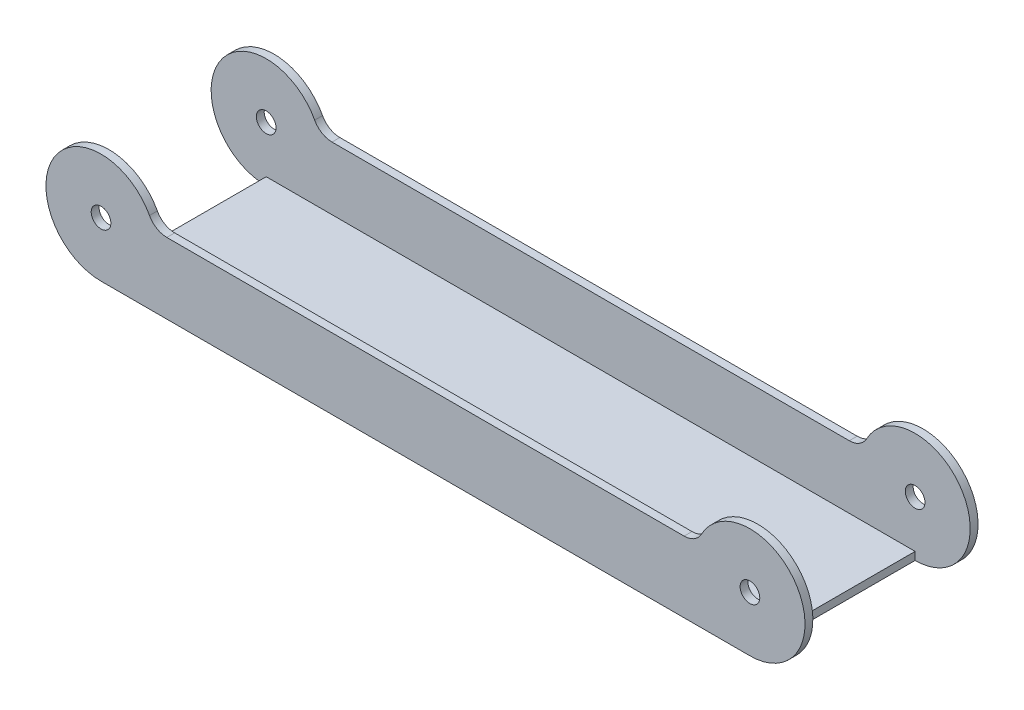
ISO-10303-21;
HEADER;
FILE_DESCRIPTION(('STEP AP214'),'2;1');
FILE_NAME('part.step','',(''),(''),'','','');
FILE_SCHEMA(('AUTOMOTIVE_DESIGN { 1 0 10303 214 1 1 1 1 }'));
ENDSEC;
DATA;
#1=APPLICATION_CONTEXT('core data for automotive mechanical design processes');
#2=APPLICATION_PROTOCOL_DEFINITION('international standard','automotive_design',2000,#1);
#3=PRODUCT_CONTEXT('',#1,'mechanical');
#4=PRODUCT('Part','Part','',(#3));
#5=PRODUCT_RELATED_PRODUCT_CATEGORY('part','',(#4));
#6=PRODUCT_DEFINITION_FORMATION('','',#4);
#7=PRODUCT_DEFINITION_CONTEXT('part definition',#1,'design');
#8=PRODUCT_DEFINITION('design','',#6,#7);
#9=PRODUCT_DEFINITION_SHAPE('','',#8);
#10=(LENGTH_UNIT() NAMED_UNIT(*) SI_UNIT(.MILLI.,.METRE.));
#11=(NAMED_UNIT(*) PLANE_ANGLE_UNIT() SI_UNIT($,.RADIAN.));
#12=(NAMED_UNIT(*) SI_UNIT($,.STERADIAN.) SOLID_ANGLE_UNIT());
#13=UNCERTAINTY_MEASURE_WITH_UNIT(LENGTH_MEASURE(1.E-05),#10,'distance_accuracy_value','');
#14=(GEOMETRIC_REPRESENTATION_CONTEXT(3) GLOBAL_UNCERTAINTY_ASSIGNED_CONTEXT((#13)) GLOBAL_UNIT_ASSIGNED_CONTEXT((#10,
#11,#12)) REPRESENTATION_CONTEXT('',''));
#15=CARTESIAN_POINT('',(0.,0.,0.));
#16=DIRECTION('',(0.,0.,1.));
#17=DIRECTION('',(1.,0.,0.));
#18=AXIS2_PLACEMENT_3D('',#15,#16,#17);
#19=CARTESIAN_POINT('',(82.5,0.,-22.));
#20=DIRECTION('',(0.,0.,1.));
#21=DIRECTION('',(1.,0.,0.));
#22=AXIS2_PLACEMENT_3D('',#19,#20,#21);
#23=CYLINDRICAL_SURFACE('',#22,14.);
#24=CARTESIAN_POINT('',(82.5,0.,-22.));
#25=DIRECTION('',(0.,0.,-1.));
#26=DIRECTION('',(1.,0.,0.));
#27=AXIS2_PLACEMENT_3D('',#24,#25,#26);
#28=CIRCLE('',#27,14.);
#29=CARTESIAN_POINT('',(70.170273293182,6.63157894736842,-22.));
#30=VERTEX_POINT('',#29);
#31=CARTESIAN_POINT('',(82.5,-14.,-22.));
#32=VERTEX_POINT('',#31);
#33=EDGE_CURVE('E276',#30,#32,#28,.T.);
#34=ORIENTED_EDGE('',*,*,#33,.F.);
#35=DIRECTION('',(0.,0.,1.));
#36=VECTOR('',#35,1.);
#37=CARTESIAN_POINT('',(70.170273293182,6.63157894736842,-22.));
#38=LINE('',#37,#36);
#39=CARTESIAN_POINT('',(70.170273293182,6.63157894736842,-20.));
#40=VERTEX_POINT('',#39);
#41=EDGE_CURVE('E139',#30,#40,#38,.T.);
#42=ORIENTED_EDGE('',*,*,#41,.T.);
#43=CARTESIAN_POINT('',(82.5,0.,-20.));
#44=DIRECTION('',(0.,0.,1.));
#45=DIRECTION('',(1.,0.,0.));
#46=AXIS2_PLACEMENT_3D('',#43,#44,#45);
#47=CIRCLE('',#46,14.);
#48=CARTESIAN_POINT('',(82.5,-14.,-20.));
#49=VERTEX_POINT('',#48);
#50=EDGE_CURVE('E132',#40,#49,#47,.F.);
#51=ORIENTED_EDGE('',*,*,#50,.T.);
#52=DIRECTION('',(0.,0.,1.));
#53=VECTOR('',#52,1.);
#54=CARTESIAN_POINT('',(82.5,-14.,-22.));
#55=LINE('',#54,#53);
#56=EDGE_CURVE('E136',#32,#49,#55,.T.);
#57=ORIENTED_EDGE('',*,*,#56,.F.);
#58=EDGE_LOOP('',(#34,#42,#51,#57));
#59=FACE_BOUND('',#58,.T.);
#60=ADVANCED_FACE('F32',(#59),#23,.T.);
#61=CARTESIAN_POINT('',(-82.5,0.,-22.));
#62=DIRECTION('',(0.,0.,1.));
#63=DIRECTION('',(1.,0.,0.));
#64=AXIS2_PLACEMENT_3D('',#61,#62,#63);
#65=CYLINDRICAL_SURFACE('',#64,14.);
#66=CARTESIAN_POINT('',(-82.5,0.,22.));
#67=DIRECTION('',(0.,0.,-1.));
#68=DIRECTION('',(1.,0.,0.));
#69=AXIS2_PLACEMENT_3D('',#66,#67,#68);
#70=CIRCLE('',#69,14.);
#71=CARTESIAN_POINT('',(-82.5,-14.,22.));
#72=VERTEX_POINT('',#71);
#73=CARTESIAN_POINT('',(-70.170273293182,6.63157894736842,22.));
#74=VERTEX_POINT('',#73);
#75=EDGE_CURVE('E269',#72,#74,#70,.T.);
#76=ORIENTED_EDGE('',*,*,#75,.T.);
#77=DIRECTION('',(0.,0.,1.));
#78=VECTOR('',#77,1.);
#79=CARTESIAN_POINT('',(-70.170273293182,6.63157894736842,-22.));
#80=LINE('',#79,#78);
#81=CARTESIAN_POINT('',(-70.170273293182,6.63157894736842,20.));
#82=VERTEX_POINT('',#81);
#83=EDGE_CURVE('E234',#74,#82,#80,.F.);
#84=ORIENTED_EDGE('',*,*,#83,.T.);
#85=CARTESIAN_POINT('',(-82.5,0.,20.));
#86=DIRECTION('',(0.,0.,-1.));
#87=DIRECTION('',(-1.,0.,0.));
#88=AXIS2_PLACEMENT_3D('',#85,#86,#87);
#89=CIRCLE('',#88,14.);
#90=CARTESIAN_POINT('',(-82.5,-14.,20.));
#91=VERTEX_POINT('',#90);
#92=EDGE_CURVE('E177',#82,#91,#89,.F.);
#93=ORIENTED_EDGE('',*,*,#92,.T.);
#94=DIRECTION('',(0.,0.,1.));
#95=VECTOR('',#94,1.);
#96=CARTESIAN_POINT('',(-82.5,-14.,-22.));
#97=LINE('',#96,#95);
#98=EDGE_CURVE('E169',#91,#72,#97,.T.);
#99=ORIENTED_EDGE('',*,*,#98,.T.);
#100=EDGE_LOOP('',(#76,#84,#93,#99));
#101=FACE_BOUND('',#100,.T.);
#102=ADVANCED_FACE('F273',(#101),#65,.T.);
#103=CARTESIAN_POINT('',(0.,-14.,0.));
#104=DIRECTION('',(0.,1.,0.));
#105=DIRECTION('',(0.,0.,1.));
#106=AXIS2_PLACEMENT_3D('',#103,#104,#105);
#107=PLANE('',#106);
#108=ORIENTED_EDGE('',*,*,#56,.T.);
#109=DIRECTION('',(0.,0.,-1.));
#110=VECTOR('',#109,1.);
#111=CARTESIAN_POINT('',(82.5,-14.,20.));
#112=LINE('',#111,#110);
#113=CARTESIAN_POINT('',(82.5,-14.,20.));
#114=VERTEX_POINT('',#113);
#115=EDGE_CURVE('E158',#114,#49,#112,.T.);
#116=ORIENTED_EDGE('',*,*,#115,.F.);
#117=CARTESIAN_POINT('',(82.5,-14.,22.));
#118=VERTEX_POINT('',#117);
#119=EDGE_CURVE('E170',#114,#118,#55,.T.);
#120=ORIENTED_EDGE('',*,*,#119,.T.);
#121=DIRECTION('',(1.,0.,0.));
#122=VECTOR('',#121,1.);
#123=CARTESIAN_POINT('',(-97.5,-14.,22.));
#124=LINE('',#123,#122);
#125=EDGE_CURVE('E210',#72,#118,#124,.T.);
#126=ORIENTED_EDGE('',*,*,#125,.F.);
#127=ORIENTED_EDGE('',*,*,#98,.F.);
#128=DIRECTION('',(0.,0.,1.));
#129=VECTOR('',#128,1.);
#130=CARTESIAN_POINT('',(-82.5,-14.,20.));
#131=LINE('',#130,#129);
#132=CARTESIAN_POINT('',(-82.5,-14.,-20.));
#133=VERTEX_POINT('',#132);
#134=EDGE_CURVE('E323',#133,#91,#131,.T.);
#135=ORIENTED_EDGE('',*,*,#134,.F.);
#136=CARTESIAN_POINT('',(-82.5,-14.,-22.));
#137=VERTEX_POINT('',#136);
#138=EDGE_CURVE('E172',#137,#133,#97,.T.);
#139=ORIENTED_EDGE('',*,*,#138,.F.);
#140=DIRECTION('',(-1.,0.,0.));
#141=VECTOR('',#140,1.);
#142=CARTESIAN_POINT('',(-97.5,-14.,-22.));
#143=LINE('',#142,#141);
#144=EDGE_CURVE('E168',#32,#137,#143,.T.);
#145=ORIENTED_EDGE('',*,*,#144,.F.);
#146=EDGE_LOOP('',(#108,#116,#120,#126,#127,#135,#139,#145));
#147=FACE_BOUND('',#146,.T.);
#148=ADVANCED_FACE('F165',(#147),#107,.F.);
#149=CARTESIAN_POINT('',(-97.5,14.,-22.));
#150=DIRECTION('',(0.,0.,1.));
#151=DIRECTION('',(1.,0.,0.));
#152=AXIS2_PLACEMENT_3D('',#149,#150,#151);
#153=PLANE('',#152);
#154=CARTESIAN_POINT('',(-82.5,0.,-22.));
#155=DIRECTION('',(0.,0.,1.));
#156=DIRECTION('',(1.,0.,0.));
#157=AXIS2_PLACEMENT_3D('',#154,#155,#156);
#158=CIRCLE('',#157,2.49999999999999);
#159=CARTESIAN_POINT('',(-80.,0.,-22.));
#160=VERTEX_POINT('',#159);
#161=EDGE_CURVE('E186',#160,#160,#158,.T.);
#162=ORIENTED_EDGE('',*,*,#161,.T.);
#163=EDGE_LOOP('',(#162));
#164=FACE_BOUND('',#163,.T.);
#165=CARTESIAN_POINT('',(82.5,0.,-22.));
#166=DIRECTION('',(0.,0.,1.));
#167=DIRECTION('',(1.,0.,0.));
#168=AXIS2_PLACEMENT_3D('',#165,#166,#167);
#169=CIRCLE('',#168,2.49999999999999);
#170=CARTESIAN_POINT('',(85.,0.,-22.));
#171=VERTEX_POINT('',#170);
#172=EDGE_CURVE('E193',#171,#171,#169,.T.);
#173=ORIENTED_EDGE('',*,*,#172,.T.);
#174=EDGE_LOOP('',(#173));
#175=FACE_BOUND('',#174,.T.);
#176=CARTESIAN_POINT('',(-82.5,0.,-22.));
#177=DIRECTION('',(0.,0.,-1.));
#178=DIRECTION('',(1.,0.,0.));
#179=AXIS2_PLACEMENT_3D('',#176,#177,#178);
#180=CIRCLE('',#179,14.);
#181=CARTESIAN_POINT('',(-70.170273293182,6.63157894736842,-22.));
#182=VERTEX_POINT('',#181);
#183=EDGE_CURVE('E282',#137,#182,#180,.T.);
#184=ORIENTED_EDGE('',*,*,#183,.T.);
#185=CARTESIAN_POINT('',(-65.7667994693185,9.,-22.));
#186=DIRECTION('',(0.,0.,1.));
#187=DIRECTION('',(1.,0.,0.));
#188=AXIS2_PLACEMENT_3D('',#185,#186,#187);
#189=CIRCLE('',#188,5.);
#190=CARTESIAN_POINT('',(-65.7667994693185,4.,-22.));
#191=VERTEX_POINT('',#190);
#192=EDGE_CURVE('E11',#182,#191,#189,.T.);
#193=ORIENTED_EDGE('',*,*,#192,.T.);
#194=DIRECTION('',(1.,0.,0.));
#195=VECTOR('',#194,1.);
#196=CARTESIAN_POINT('',(-69.0835921350013,4.,-22.));
#197=LINE('',#196,#195);
#198=CARTESIAN_POINT('',(65.7667994693185,4.,-22.));
#199=VERTEX_POINT('',#198);
#200=EDGE_CURVE('E174',#191,#199,#197,.T.);
#201=ORIENTED_EDGE('',*,*,#200,.T.);
#202=CARTESIAN_POINT('',(65.7667994693185,9.,-22.));
#203=DIRECTION('',(0.,0.,1.));
#204=DIRECTION('',(1.,0.,0.));
#205=AXIS2_PLACEMENT_3D('',#202,#203,#204);
#206=CIRCLE('',#205,5.);
#207=EDGE_CURVE('E239',#199,#30,#206,.T.);
#208=ORIENTED_EDGE('',*,*,#207,.T.);
#209=ORIENTED_EDGE('',*,*,#33,.T.);
#210=ORIENTED_EDGE('',*,*,#144,.T.);
#211=EDGE_LOOP('',(#184,#193,#201,#208,#209,#210));
#212=FACE_BOUND('',#211,.T.);
#213=ADVANCED_FACE('F287',(#164,#175,#212),#153,.F.);
#214=CARTESIAN_POINT('',(-97.5,14.,22.));
#215=DIRECTION('',(0.,0.,-1.));
#216=DIRECTION('',(-1.,0.,0.));
#217=AXIS2_PLACEMENT_3D('',#214,#215,#216);
#218=PLANE('',#217);
#219=CARTESIAN_POINT('',(-82.5,0.,22.));
#220=DIRECTION('',(0.,0.,1.));
#221=DIRECTION('',(1.,0.,0.));
#222=AXIS2_PLACEMENT_3D('',#219,#220,#221);
#223=CIRCLE('',#222,2.49999999999999);
#224=CARTESIAN_POINT('',(-80.,0.,22.));
#225=VERTEX_POINT('',#224);
#226=EDGE_CURVE('E190',#225,#225,#223,.T.);
#227=ORIENTED_EDGE('',*,*,#226,.F.);
#228=EDGE_LOOP('',(#227));
#229=FACE_BOUND('',#228,.T.);
#230=CARTESIAN_POINT('',(82.5,0.,22.));
#231=DIRECTION('',(0.,0.,1.));
#232=DIRECTION('',(1.,0.,0.));
#233=AXIS2_PLACEMENT_3D('',#230,#231,#232);
#234=CIRCLE('',#233,2.49999999999999);
#235=CARTESIAN_POINT('',(85.,0.,22.));
#236=VERTEX_POINT('',#235);
#237=EDGE_CURVE('E185',#236,#236,#234,.T.);
#238=ORIENTED_EDGE('',*,*,#237,.F.);
#239=EDGE_LOOP('',(#238));
#240=FACE_BOUND('',#239,.T.);
#241=ORIENTED_EDGE('',*,*,#125,.T.);
#242=CARTESIAN_POINT('',(82.5,0.,22.));
#243=DIRECTION('',(0.,0.,-1.));
#244=DIRECTION('',(1.,0.,0.));
#245=AXIS2_PLACEMENT_3D('',#242,#243,#244);
#246=CIRCLE('',#245,14.);
#247=CARTESIAN_POINT('',(70.170273293182,6.63157894736842,22.));
#248=VERTEX_POINT('',#247);
#249=EDGE_CURVE('E153',#248,#118,#246,.T.);
#250=ORIENTED_EDGE('',*,*,#249,.F.);
#251=CARTESIAN_POINT('',(65.7667994693185,9.,22.));
#252=DIRECTION('',(0.,0.,-1.));
#253=DIRECTION('',(-1.,0.,0.));
#254=AXIS2_PLACEMENT_3D('',#251,#252,#253);
#255=CIRCLE('',#254,5.);
#256=CARTESIAN_POINT('',(65.7667994693185,4.,22.));
#257=VERTEX_POINT('',#256);
#258=EDGE_CURVE('E241',#248,#257,#255,.T.);
#259=ORIENTED_EDGE('',*,*,#258,.T.);
#260=DIRECTION('',(1.,0.,0.));
#261=VECTOR('',#260,1.);
#262=CARTESIAN_POINT('',(-69.0835921350013,4.,22.));
#263=LINE('',#262,#261);
#264=CARTESIAN_POINT('',(-65.7667994693185,4.,22.));
#265=VERTEX_POINT('',#264);
#266=EDGE_CURVE('E271',#265,#257,#263,.T.);
#267=ORIENTED_EDGE('',*,*,#266,.F.);
#268=CARTESIAN_POINT('',(-65.7667994693185,9.,22.));
#269=DIRECTION('',(0.,0.,-1.));
#270=DIRECTION('',(-1.,0.,0.));
#271=AXIS2_PLACEMENT_3D('',#268,#269,#270);
#272=CIRCLE('',#271,5.);
#273=EDGE_CURVE('E245',#265,#74,#272,.T.);
#274=ORIENTED_EDGE('',*,*,#273,.T.);
#275=ORIENTED_EDGE('',*,*,#75,.F.);
#276=EDGE_LOOP('',(#241,#250,#259,#267,#274,#275));
#277=FACE_BOUND('',#276,.T.);
#278=ADVANCED_FACE('F268',(#229,#240,#277),#218,.F.);
#279=CARTESIAN_POINT('',(-97.5,14.,-20.));
#280=DIRECTION('',(0.,0.,1.));
#281=DIRECTION('',(1.,0.,0.));
#282=AXIS2_PLACEMENT_3D('',#279,#280,#281);
#283=PLANE('',#282);
#284=DIRECTION('',(-1.,0.,0.));
#285=VECTOR('',#284,1.);
#286=CARTESIAN_POINT('',(-97.5,-12.,-20.));
#287=LINE('',#286,#285);
#288=CARTESIAN_POINT('',(82.5,-12.,-20.));
#289=VERTEX_POINT('',#288);
#290=CARTESIAN_POINT('',(-82.5,-12.,-20.));
#291=VERTEX_POINT('',#290);
#292=EDGE_CURVE('E149',#289,#291,#287,.T.);
#293=ORIENTED_EDGE('',*,*,#292,.F.);
#294=DIRECTION('',(0.,-1.,0.));
#295=VECTOR('',#294,1.);
#296=CARTESIAN_POINT('',(82.5,14.001,-20.));
#297=LINE('',#296,#295);
#298=EDGE_CURVE('E144',#289,#49,#297,.T.);
#299=ORIENTED_EDGE('',*,*,#298,.T.);
#300=ORIENTED_EDGE('',*,*,#50,.F.);
#301=CARTESIAN_POINT('',(65.7667994693185,9.,-20.));
#302=DIRECTION('',(0.,0.,1.));
#303=DIRECTION('',(1.,0.,0.));
#304=AXIS2_PLACEMENT_3D('',#301,#302,#303);
#305=CIRCLE('',#304,5.);
#306=CARTESIAN_POINT('',(65.7667994693185,4.,-20.));
#307=VERTEX_POINT('',#306);
#308=EDGE_CURVE('E237',#40,#307,#305,.F.);
#309=ORIENTED_EDGE('',*,*,#308,.T.);
#310=DIRECTION('',(1.,0.,0.));
#311=VECTOR('',#310,1.);
#312=CARTESIAN_POINT('',(-97.5,4.,-20.));
#313=LINE('',#312,#311);
#314=CARTESIAN_POINT('',(-65.7667994693185,4.,-20.));
#315=VERTEX_POINT('',#314);
#316=EDGE_CURVE('E140',#315,#307,#313,.T.);
#317=ORIENTED_EDGE('',*,*,#316,.F.);
#318=CARTESIAN_POINT('',(-65.7667994693185,9.,-20.));
#319=DIRECTION('',(0.,0.,1.));
#320=DIRECTION('',(1.,0.,0.));
#321=AXIS2_PLACEMENT_3D('',#318,#319,#320);
#322=CIRCLE('',#321,5.);
#323=CARTESIAN_POINT('',(-70.170273293182,6.63157894736842,-20.));
#324=VERTEX_POINT('',#323);
#325=EDGE_CURVE('E40',#315,#324,#322,.F.);
#326=ORIENTED_EDGE('',*,*,#325,.T.);
#327=CARTESIAN_POINT('',(-82.5,0.,-20.));
#328=DIRECTION('',(0.,0.,1.));
#329=DIRECTION('',(1.,0.,0.));
#330=AXIS2_PLACEMENT_3D('',#327,#328,#329);
#331=CIRCLE('',#330,14.);
#332=EDGE_CURVE('E179',#133,#324,#331,.F.);
#333=ORIENTED_EDGE('',*,*,#332,.F.);
#334=DIRECTION('',(0.,-1.,0.));
#335=VECTOR('',#334,1.);
#336=CARTESIAN_POINT('',(-82.5,14.001,-20.));
#337=LINE('',#336,#335);
#338=EDGE_CURVE('E327',#291,#133,#337,.T.);
#339=ORIENTED_EDGE('',*,*,#338,.F.);
#340=EDGE_LOOP('',(#293,#299,#300,#309,#317,#326,#333,#339));
#341=FACE_BOUND('',#340,.T.);
#342=CARTESIAN_POINT('',(-82.5,0.,-20.));
#343=DIRECTION('',(0.,0.,1.));
#344=DIRECTION('',(1.,0.,0.));
#345=AXIS2_PLACEMENT_3D('',#342,#343,#344);
#346=CIRCLE('',#345,2.49999999999999);
#347=CARTESIAN_POINT('',(-80.,0.,-20.));
#348=VERTEX_POINT('',#347);
#349=EDGE_CURVE('E202',#348,#348,#346,.T.);
#350=ORIENTED_EDGE('',*,*,#349,.F.);
#351=EDGE_LOOP('',(#350));
#352=FACE_BOUND('',#351,.T.);
#353=CARTESIAN_POINT('',(82.5,0.,-20.));
#354=DIRECTION('',(0.,0.,1.));
#355=DIRECTION('',(1.,0.,0.));
#356=AXIS2_PLACEMENT_3D('',#353,#354,#355);
#357=CIRCLE('',#356,2.49999999999999);
#358=CARTESIAN_POINT('',(85.,0.,-20.));
#359=VERTEX_POINT('',#358);
#360=EDGE_CURVE('E198',#359,#359,#357,.T.);
#361=ORIENTED_EDGE('',*,*,#360,.F.);
#362=EDGE_LOOP('',(#361));
#363=FACE_BOUND('',#362,.T.);
#364=ADVANCED_FACE('F146',(#341,#352,#363),#283,.T.);
#365=CARTESIAN_POINT('',(-97.5,14.,20.));
#366=DIRECTION('',(0.,0.,-1.));
#367=DIRECTION('',(-1.,0.,0.));
#368=AXIS2_PLACEMENT_3D('',#365,#366,#367);
#369=PLANE('',#368);
#370=CARTESIAN_POINT('',(82.5,0.,20.));
#371=DIRECTION('',(0.,0.,-1.));
#372=DIRECTION('',(-1.,0.,0.));
#373=AXIS2_PLACEMENT_3D('',#370,#371,#372);
#374=CIRCLE('',#373,14.);
#375=CARTESIAN_POINT('',(70.170273293182,6.63157894736842,20.));
#376=VERTEX_POINT('',#375);
#377=EDGE_CURVE('E141',#114,#376,#374,.F.);
#378=ORIENTED_EDGE('',*,*,#377,.F.);
#379=DIRECTION('',(0.,-1.,0.));
#380=VECTOR('',#379,1.);
#381=CARTESIAN_POINT('',(82.5,14.001,20.));
#382=LINE('',#381,#380);
#383=CARTESIAN_POINT('',(82.5,-12.,20.));
#384=VERTEX_POINT('',#383);
#385=EDGE_CURVE('E154',#384,#114,#382,.T.);
#386=ORIENTED_EDGE('',*,*,#385,.F.);
#387=DIRECTION('',(1.,0.,0.));
#388=VECTOR('',#387,1.);
#389=CARTESIAN_POINT('',(-97.5,-12.,20.));
#390=LINE('',#389,#388);
#391=CARTESIAN_POINT('',(-82.5,-12.,20.));
#392=VERTEX_POINT('',#391);
#393=EDGE_CURVE('E206',#392,#384,#390,.T.);
#394=ORIENTED_EDGE('',*,*,#393,.F.);
#395=DIRECTION('',(0.,-1.,0.));
#396=VECTOR('',#395,1.);
#397=CARTESIAN_POINT('',(-82.5,14.001,20.));
#398=LINE('',#397,#396);
#399=EDGE_CURVE('E333',#392,#91,#398,.T.);
#400=ORIENTED_EDGE('',*,*,#399,.T.);
#401=ORIENTED_EDGE('',*,*,#92,.F.);
#402=CARTESIAN_POINT('',(-65.7667994693185,9.,20.));
#403=DIRECTION('',(0.,0.,-1.));
#404=DIRECTION('',(-1.,0.,0.));
#405=AXIS2_PLACEMENT_3D('',#402,#403,#404);
#406=CIRCLE('',#405,5.);
#407=CARTESIAN_POINT('',(-65.7667994693185,4.,20.));
#408=VERTEX_POINT('',#407);
#409=EDGE_CURVE('E247',#82,#408,#406,.F.);
#410=ORIENTED_EDGE('',*,*,#409,.T.);
#411=DIRECTION('',(-1.,0.,0.));
#412=VECTOR('',#411,1.);
#413=CARTESIAN_POINT('',(-97.5,4.,20.));
#414=LINE('',#413,#412);
#415=CARTESIAN_POINT('',(65.7667994693185,4.,20.));
#416=VERTEX_POINT('',#415);
#417=EDGE_CURVE('E213',#416,#408,#414,.T.);
#418=ORIENTED_EDGE('',*,*,#417,.F.);
#419=CARTESIAN_POINT('',(65.7667994693185,9.,20.));
#420=DIRECTION('',(0.,0.,-1.));
#421=DIRECTION('',(-1.,0.,0.));
#422=AXIS2_PLACEMENT_3D('',#419,#420,#421);
#423=CIRCLE('',#422,5.);
#424=EDGE_CURVE('E243',#416,#376,#423,.F.);
#425=ORIENTED_EDGE('',*,*,#424,.T.);
#426=EDGE_LOOP('',(#378,#386,#394,#400,#401,#410,#418,#425));
#427=FACE_BOUND('',#426,.T.);
#428=CARTESIAN_POINT('',(-82.5,0.,20.));
#429=DIRECTION('',(0.,0.,-1.));
#430=DIRECTION('',(-1.,0.,0.));
#431=AXIS2_PLACEMENT_3D('',#428,#429,#430);
#432=CIRCLE('',#431,2.49999999999999);
#433=CARTESIAN_POINT('',(-85.,0.,20.));
#434=VERTEX_POINT('',#433);
#435=EDGE_CURVE('E201',#434,#434,#432,.T.);
#436=ORIENTED_EDGE('',*,*,#435,.F.);
#437=EDGE_LOOP('',(#436));
#438=FACE_BOUND('',#437,.T.);
#439=CARTESIAN_POINT('',(82.5,0.,20.));
#440=DIRECTION('',(0.,0.,-1.));
#441=DIRECTION('',(-1.,0.,0.));
#442=AXIS2_PLACEMENT_3D('',#439,#440,#441);
#443=CIRCLE('',#442,2.49999999999999);
#444=CARTESIAN_POINT('',(80.,0.,20.));
#445=VERTEX_POINT('',#444);
#446=EDGE_CURVE('E189',#445,#445,#443,.T.);
#447=ORIENTED_EDGE('',*,*,#446,.F.);
#448=EDGE_LOOP('',(#447));
#449=FACE_BOUND('',#448,.T.);
#450=ADVANCED_FACE('F252',(#427,#438,#449),#369,.T.);
#451=CARTESIAN_POINT('',(0.,-12.,0.));
#452=DIRECTION('',(0.,1.,0.));
#453=DIRECTION('',(0.,0.,1.));
#454=AXIS2_PLACEMENT_3D('',#451,#452,#453);
#455=PLANE('',#454);
#456=DIRECTION('',(0.,0.,-1.));
#457=VECTOR('',#456,1.);
#458=CARTESIAN_POINT('',(82.5,-12.,20.));
#459=LINE('',#458,#457);
#460=EDGE_CURVE('E163',#384,#289,#459,.T.);
#461=ORIENTED_EDGE('',*,*,#460,.T.);
#462=ORIENTED_EDGE('',*,*,#292,.T.);
#463=DIRECTION('',(0.,0.,1.));
#464=VECTOR('',#463,1.);
#465=CARTESIAN_POINT('',(-82.5,-12.,20.));
#466=LINE('',#465,#464);
#467=EDGE_CURVE('E328',#291,#392,#466,.T.);
#468=ORIENTED_EDGE('',*,*,#467,.T.);
#469=ORIENTED_EDGE('',*,*,#393,.T.);
#470=EDGE_LOOP('',(#461,#462,#468,#469));
#471=FACE_BOUND('',#470,.T.);
#472=ADVANCED_FACE('F339',(#471),#455,.T.);
#473=CARTESIAN_POINT('',(82.5,0.,-22.));
#474=DIRECTION('',(0.,0.,1.));
#475=DIRECTION('',(1.,0.,0.));
#476=AXIS2_PLACEMENT_3D('',#473,#474,#475);
#477=CYLINDRICAL_SURFACE('',#476,2.49999999999999);
#478=ORIENTED_EDGE('',*,*,#446,.T.);
#479=EDGE_LOOP('',(#478));
#480=FACE_BOUND('',#479,.T.);
#481=ORIENTED_EDGE('',*,*,#237,.T.);
#482=EDGE_LOOP('',(#481));
#483=FACE_BOUND('',#482,.T.);
#484=ADVANCED_FACE('F342',(#480,#483),#477,.F.);
#485=CARTESIAN_POINT('',(-82.5,0.,-22.));
#486=DIRECTION('',(0.,0.,1.));
#487=DIRECTION('',(1.,0.,0.));
#488=AXIS2_PLACEMENT_3D('',#485,#486,#487);
#489=CYLINDRICAL_SURFACE('',#488,2.49999999999999);
#490=ORIENTED_EDGE('',*,*,#435,.T.);
#491=EDGE_LOOP('',(#490));
#492=FACE_BOUND('',#491,.T.);
#493=ORIENTED_EDGE('',*,*,#226,.T.);
#494=EDGE_LOOP('',(#493));
#495=FACE_BOUND('',#494,.T.);
#496=ADVANCED_FACE('F348',(#492,#495),#489,.F.);
#497=ORIENTED_EDGE('',*,*,#360,.T.);
#498=EDGE_LOOP('',(#497));
#499=FACE_BOUND('',#498,.T.);
#500=ORIENTED_EDGE('',*,*,#172,.F.);
#501=EDGE_LOOP('',(#500));
#502=FACE_BOUND('',#501,.T.);
#503=ADVANCED_FACE('F351',(#499,#502),#477,.F.);
#504=ORIENTED_EDGE('',*,*,#349,.T.);
#505=EDGE_LOOP('',(#504));
#506=FACE_BOUND('',#505,.T.);
#507=ORIENTED_EDGE('',*,*,#161,.F.);
#508=EDGE_LOOP('',(#507));
#509=FACE_BOUND('',#508,.T.);
#510=ADVANCED_FACE('F316',(#506,#509),#489,.F.);
#511=CARTESIAN_POINT('',(-69.0835921350013,4.,-22.));
#512=DIRECTION('',(0.,-1.,0.));
#513=DIRECTION('',(0.,0.,-1.));
#514=AXIS2_PLACEMENT_3D('',#511,#512,#513);
#515=PLANE('',#514);
#516=ORIENTED_EDGE('',*,*,#316,.T.);
#517=DIRECTION('',(0.,0.,-1.));
#518=VECTOR('',#517,1.);
#519=CARTESIAN_POINT('',(65.7667994693185,4.,-22.));
#520=LINE('',#519,#518);
#521=EDGE_CURVE('E224',#307,#199,#520,.T.);
#522=ORIENTED_EDGE('',*,*,#521,.T.);
#523=ORIENTED_EDGE('',*,*,#200,.F.);
#524=DIRECTION('',(0.,0.,-1.));
#525=VECTOR('',#524,1.);
#526=CARTESIAN_POINT('',(-65.7667994693185,4.,-20.));
#527=LINE('',#526,#525);
#528=EDGE_CURVE('E221',#191,#315,#527,.F.);
#529=ORIENTED_EDGE('',*,*,#528,.T.);
#530=EDGE_LOOP('',(#516,#522,#523,#529));
#531=FACE_BOUND('',#530,.T.);
#532=ADVANCED_FACE('F294',(#531),#515,.F.);
#533=ORIENTED_EDGE('',*,*,#377,.T.);
#534=DIRECTION('',(0.,0.,1.));
#535=VECTOR('',#534,1.);
#536=CARTESIAN_POINT('',(70.170273293182,6.63157894736842,-22.));
#537=LINE('',#536,#535);
#538=EDGE_CURVE('E226',#376,#248,#537,.T.);
#539=ORIENTED_EDGE('',*,*,#538,.T.);
#540=ORIENTED_EDGE('',*,*,#249,.T.);
#541=ORIENTED_EDGE('',*,*,#119,.F.);
#542=EDGE_LOOP('',(#533,#539,#540,#541));
#543=FACE_BOUND('',#542,.T.);
#544=ADVANCED_FACE('F303',(#543),#23,.T.);
#545=ORIENTED_EDGE('',*,*,#332,.T.);
#546=DIRECTION('',(0.,0.,1.));
#547=VECTOR('',#546,1.);
#548=CARTESIAN_POINT('',(-70.170273293182,6.63157894736842,-22.));
#549=LINE('',#548,#547);
#550=EDGE_CURVE('E47',#324,#182,#549,.F.);
#551=ORIENTED_EDGE('',*,*,#550,.T.);
#552=ORIENTED_EDGE('',*,*,#183,.F.);
#553=ORIENTED_EDGE('',*,*,#138,.T.);
#554=EDGE_LOOP('',(#545,#551,#552,#553));
#555=FACE_BOUND('',#554,.T.);
#556=ADVANCED_FACE('F308',(#555),#65,.T.);
#557=ORIENTED_EDGE('',*,*,#266,.T.);
#558=DIRECTION('',(0.,0.,-1.));
#559=VECTOR('',#558,1.);
#560=CARTESIAN_POINT('',(65.7667994693185,4.,20.));
#561=LINE('',#560,#559);
#562=EDGE_CURVE('E232',#257,#416,#561,.T.);
#563=ORIENTED_EDGE('',*,*,#562,.T.);
#564=ORIENTED_EDGE('',*,*,#417,.T.);
#565=DIRECTION('',(0.,0.,-1.));
#566=VECTOR('',#565,1.);
#567=CARTESIAN_POINT('',(-65.7667994693185,4.,22.));
#568=LINE('',#567,#566);
#569=EDGE_CURVE('E229',#408,#265,#568,.F.);
#570=ORIENTED_EDGE('',*,*,#569,.T.);
#571=EDGE_LOOP('',(#557,#563,#564,#570));
#572=FACE_BOUND('',#571,.T.);
#573=ADVANCED_FACE('F261',(#572),#515,.F.);
#574=CARTESIAN_POINT('',(-82.5,14.001,20.));
#575=DIRECTION('',(1.,0.,0.));
#576=DIRECTION('',(0.,0.,-1.));
#577=AXIS2_PLACEMENT_3D('',#574,#575,#576);
#578=PLANE('',#577);
#579=ORIENTED_EDGE('',*,*,#338,.T.);
#580=ORIENTED_EDGE('',*,*,#134,.T.);
#581=ORIENTED_EDGE('',*,*,#399,.F.);
#582=ORIENTED_EDGE('',*,*,#467,.F.);
#583=EDGE_LOOP('',(#579,#580,#581,#582));
#584=FACE_BOUND('',#583,.T.);
#585=ADVANCED_FACE('F331',(#584),#578,.F.);
#586=CARTESIAN_POINT('',(82.5,14.001,20.));
#587=DIRECTION('',(-1.,0.,0.));
#588=DIRECTION('',(0.,0.,1.));
#589=AXIS2_PLACEMENT_3D('',#586,#587,#588);
#590=PLANE('',#589);
#591=ORIENTED_EDGE('',*,*,#385,.T.);
#592=ORIENTED_EDGE('',*,*,#115,.T.);
#593=ORIENTED_EDGE('',*,*,#298,.F.);
#594=ORIENTED_EDGE('',*,*,#460,.F.);
#595=EDGE_LOOP('',(#591,#592,#593,#594));
#596=FACE_BOUND('',#595,.T.);
#597=ADVANCED_FACE('F159',(#596),#590,.F.);
#598=CARTESIAN_POINT('',(65.7667994693185,9.,-22.));
#599=DIRECTION('',(0.,0.,1.));
#600=DIRECTION('',(1.,0.,0.));
#601=AXIS2_PLACEMENT_3D('',#598,#599,#600);
#602=CYLINDRICAL_SURFACE('',#601,5.);
#603=ORIENTED_EDGE('',*,*,#207,.F.);
#604=ORIENTED_EDGE('',*,*,#521,.F.);
#605=ORIENTED_EDGE('',*,*,#308,.F.);
#606=ORIENTED_EDGE('',*,*,#41,.F.);
#607=EDGE_LOOP('',(#603,#604,#605,#606));
#608=FACE_BOUND('',#607,.T.);
#609=ADVANCED_FACE('F293',(#608),#602,.F.);
#610=CARTESIAN_POINT('',(65.7667994693185,9.,-22.));
#611=DIRECTION('',(0.,0.,1.));
#612=DIRECTION('',(1.,0.,0.));
#613=AXIS2_PLACEMENT_3D('',#610,#611,#612);
#614=CYLINDRICAL_SURFACE('',#613,5.);
#615=ORIENTED_EDGE('',*,*,#424,.F.);
#616=ORIENTED_EDGE('',*,*,#562,.F.);
#617=ORIENTED_EDGE('',*,*,#258,.F.);
#618=ORIENTED_EDGE('',*,*,#538,.F.);
#619=EDGE_LOOP('',(#615,#616,#617,#618));
#620=FACE_BOUND('',#619,.T.);
#621=ADVANCED_FACE('F300',(#620),#614,.F.);
#622=CARTESIAN_POINT('',(-65.7667994693185,9.,-22.));
#623=DIRECTION('',(0.,0.,1.));
#624=DIRECTION('',(1.,0.,0.));
#625=AXIS2_PLACEMENT_3D('',#622,#623,#624);
#626=CYLINDRICAL_SURFACE('',#625,5.);
#627=ORIENTED_EDGE('',*,*,#409,.F.);
#628=ORIENTED_EDGE('',*,*,#83,.F.);
#629=ORIENTED_EDGE('',*,*,#273,.F.);
#630=ORIENTED_EDGE('',*,*,#569,.F.);
#631=EDGE_LOOP('',(#627,#628,#629,#630));
#632=FACE_BOUND('',#631,.T.);
#633=ADVANCED_FACE('F264',(#632),#626,.F.);
#634=CARTESIAN_POINT('',(-65.7667994693185,9.,-22.));
#635=DIRECTION('',(0.,0.,1.));
#636=DIRECTION('',(1.,0.,0.));
#637=AXIS2_PLACEMENT_3D('',#634,#635,#636);
#638=CYLINDRICAL_SURFACE('',#637,5.);
#639=ORIENTED_EDGE('',*,*,#192,.F.);
#640=ORIENTED_EDGE('',*,*,#550,.F.);
#641=ORIENTED_EDGE('',*,*,#325,.F.);
#642=ORIENTED_EDGE('',*,*,#528,.F.);
#643=EDGE_LOOP('',(#639,#640,#641,#642));
#644=FACE_BOUND('',#643,.T.);
#645=ADVANCED_FACE('F34',(#644),#638,.F.);
#646=CLOSED_SHELL('',(#60,#102,#148,#213,#278,#364,#450,#472,#484,#496,#503,#510,#532,#544,#556,
#573,#585,#597,#609,#621,#633,#645));
#647=MANIFOLD_SOLID_BREP('B2',#646);
#648=ADVANCED_BREP_SHAPE_REPRESENTATION('',(#18,#647),#14);
#649=SHAPE_DEFINITION_REPRESENTATION(#9,#648);
ENDSEC;
END-ISO-10303-21;
